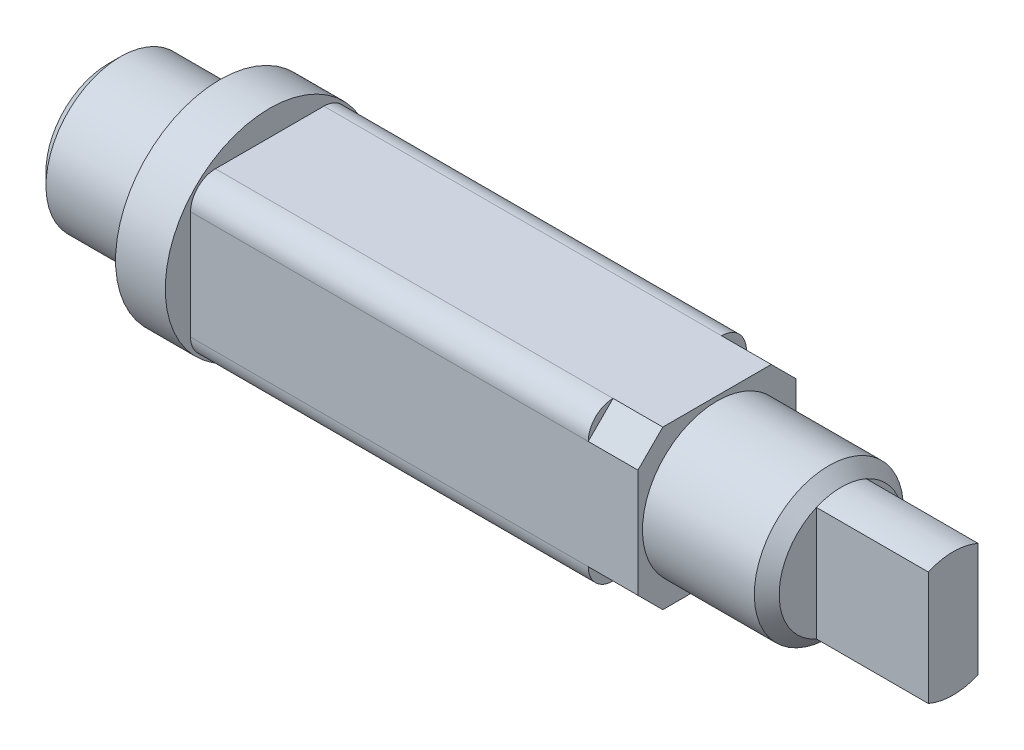
ISO-10303-21;
HEADER;
FILE_DESCRIPTION(('STEP AP214'),'2;1');
FILE_NAME('part.step','',(''),(''),'','','');
FILE_SCHEMA(('AUTOMOTIVE_DESIGN { 1 0 10303 214 1 1 1 1 }'));
ENDSEC;
DATA;
#1=APPLICATION_CONTEXT('core data for automotive mechanical design processes');
#2=APPLICATION_PROTOCOL_DEFINITION('international standard','automotive_design',2000,#1);
#3=PRODUCT_CONTEXT('',#1,'mechanical');
#4=PRODUCT('Part','Part','',(#3));
#5=PRODUCT_RELATED_PRODUCT_CATEGORY('part','',(#4));
#6=PRODUCT_DEFINITION_FORMATION('','',#4);
#7=PRODUCT_DEFINITION_CONTEXT('part definition',#1,'design');
#8=PRODUCT_DEFINITION('design','',#6,#7);
#9=PRODUCT_DEFINITION_SHAPE('','',#8);
#10=(LENGTH_UNIT() NAMED_UNIT(*) SI_UNIT(.MILLI.,.METRE.));
#11=(NAMED_UNIT(*) PLANE_ANGLE_UNIT() SI_UNIT($,.RADIAN.));
#12=(NAMED_UNIT(*) SI_UNIT($,.STERADIAN.) SOLID_ANGLE_UNIT());
#13=UNCERTAINTY_MEASURE_WITH_UNIT(LENGTH_MEASURE(1.E-05),#10,'distance_accuracy_value','');
#14=(GEOMETRIC_REPRESENTATION_CONTEXT(3) GLOBAL_UNCERTAINTY_ASSIGNED_CONTEXT((#13)) GLOBAL_UNIT_ASSIGNED_CONTEXT((#10,
#11,#12)) REPRESENTATION_CONTEXT('',''));
#15=CARTESIAN_POINT('',(0.,0.,0.));
#16=DIRECTION('',(0.,0.,1.));
#17=DIRECTION('',(1.,0.,0.));
#18=AXIS2_PLACEMENT_3D('',#15,#16,#17);
#19=CARTESIAN_POINT('',(29.,2.5,0.));
#20=DIRECTION('',(1.,0.,0.));
#21=DIRECTION('',(0.,1.,0.));
#22=AXIS2_PLACEMENT_3D('',#19,#20,#21);
#23=PLANE('',#22);
#24=CARTESIAN_POINT('',(29.,0.,0.));
#25=DIRECTION('',(1.,0.,0.));
#26=DIRECTION('',(0.,1.,0.));
#27=AXIS2_PLACEMENT_3D('',#24,#25,#26);
#28=CIRCLE('',#27,2.5);
#29=CARTESIAN_POINT('',(29.,-2.29128784747792,-1.));
#30=VERTEX_POINT('',#29);
#31=CARTESIAN_POINT('',(29.,2.29128784747792,-1.));
#32=VERTEX_POINT('',#31);
#33=EDGE_CURVE('E533',#30,#32,#28,.T.);
#34=ORIENTED_EDGE('',*,*,#33,.T.);
#35=DIRECTION('',(0.,-1.,0.));
#36=VECTOR('',#35,1.);
#37=CARTESIAN_POINT('',(29.,2.5,-1.));
#38=LINE('',#37,#36);
#39=EDGE_CURVE('E58',#32,#30,#38,.T.);
#40=ORIENTED_EDGE('',*,*,#39,.T.);
#41=EDGE_LOOP('',(#34,#40));
#42=FACE_BOUND('',#41,.T.);
#43=ADVANCED_FACE('F37',(#42),#23,.T.);
#44=CARTESIAN_POINT('',(29.,2.29128784747792,1.));
#45=VERTEX_POINT('',#44);
#46=CARTESIAN_POINT('',(29.,-2.29128784747792,1.));
#47=VERTEX_POINT('',#46);
#48=EDGE_CURVE('E182',#45,#47,#28,.T.);
#49=ORIENTED_EDGE('',*,*,#48,.T.);
#50=DIRECTION('',(0.,1.,0.));
#51=VECTOR('',#50,1.);
#52=CARTESIAN_POINT('',(29.,2.5,1.));
#53=LINE('',#52,#51);
#54=EDGE_CURVE('E173',#47,#45,#53,.T.);
#55=ORIENTED_EDGE('',*,*,#54,.T.);
#56=EDGE_LOOP('',(#49,#55));
#57=FACE_BOUND('',#56,.T.);
#58=ADVANCED_FACE('F318',(#57),#23,.T.);
#59=CARTESIAN_POINT('',(22.,2.18198051533946,-2.18198051533946));
#60=DIRECTION('',(1.,0.,0.));
#61=DIRECTION('',(0.,0.,-1.));
#62=AXIS2_PLACEMENT_3D('',#59,#60,#61);
#63=PLANE('',#62);
#64=DIRECTION('',(0.,0.707106781186548,0.707106781186547));
#65=VECTOR('',#64,1.);
#66=CARTESIAN_POINT('',(22.,2.18198051533946,-3.18198051533946));
#67=LINE('',#66,#65);
#68=CARTESIAN_POINT('',(22.,2.18198051533946,-3.18198051533946));
#69=VERTEX_POINT('',#68);
#70=CARTESIAN_POINT('',(22.,3.18198051533946,-2.18198051533946));
#71=VERTEX_POINT('',#70);
#72=EDGE_CURVE('E193',#69,#71,#67,.T.);
#73=ORIENTED_EDGE('',*,*,#72,.F.);
#74=CARTESIAN_POINT('',(22.,2.18198051533946,-2.18198051533946));
#75=DIRECTION('',(1.,0.,0.));
#76=DIRECTION('',(0.,0.,-1.));
#77=AXIS2_PLACEMENT_3D('',#74,#75,#76);
#78=CIRCLE('',#77,1.);
#79=EDGE_CURVE('E242',#69,#71,#78,.T.);
#80=ORIENTED_EDGE('',*,*,#79,.T.);
#81=EDGE_LOOP('',(#73,#80));
#82=FACE_BOUND('',#81,.T.);
#83=ADVANCED_FACE('F323',(#82),#63,.T.);
#84=DIRECTION('',(0.,0.707106781186548,-0.707106781186548));
#85=VECTOR('',#84,1.);
#86=CARTESIAN_POINT('',(22.,-2.18198051533946,-3.18198051533946));
#87=LINE('',#86,#85);
#88=CARTESIAN_POINT('',(22.,-3.18198051533946,-2.18198051533946));
#89=VERTEX_POINT('',#88);
#90=CARTESIAN_POINT('',(22.,-2.18198051533946,-3.18198051533946));
#91=VERTEX_POINT('',#90);
#92=EDGE_CURVE('E213',#89,#91,#87,.T.);
#93=ORIENTED_EDGE('',*,*,#92,.F.);
#94=CARTESIAN_POINT('',(22.,-2.18198051533946,-2.18198051533946));
#95=DIRECTION('',(1.,0.,0.));
#96=DIRECTION('',(0.,0.,-1.));
#97=AXIS2_PLACEMENT_3D('',#94,#95,#96);
#98=CIRCLE('',#97,1.);
#99=EDGE_CURVE('E250',#89,#91,#98,.T.);
#100=ORIENTED_EDGE('',*,*,#99,.T.);
#101=EDGE_LOOP('',(#93,#100));
#102=FACE_BOUND('',#101,.T.);
#103=ADVANCED_FACE('F443',(#102),#63,.T.);
#104=DIRECTION('',(0.,-0.707106781186548,-0.707106781186548));
#105=VECTOR('',#104,1.);
#106=CARTESIAN_POINT('',(22.,-3.18198051533946,2.18198051533946));
#107=LINE('',#106,#105);
#108=CARTESIAN_POINT('',(22.,-2.18198051533946,3.18198051533946));
#109=VERTEX_POINT('',#108);
#110=CARTESIAN_POINT('',(22.,-3.18198051533946,2.18198051533946));
#111=VERTEX_POINT('',#110);
#112=EDGE_CURVE('E210',#109,#111,#107,.T.);
#113=ORIENTED_EDGE('',*,*,#112,.F.);
#114=CARTESIAN_POINT('',(22.,-2.18198051533946,2.18198051533946));
#115=DIRECTION('',(1.,0.,0.));
#116=DIRECTION('',(0.,0.,-1.));
#117=AXIS2_PLACEMENT_3D('',#114,#115,#116);
#118=CIRCLE('',#117,1.);
#119=EDGE_CURVE('E248',#109,#111,#118,.T.);
#120=ORIENTED_EDGE('',*,*,#119,.T.);
#121=EDGE_LOOP('',(#113,#120));
#122=FACE_BOUND('',#121,.T.);
#123=ADVANCED_FACE('F314',(#122),#63,.T.);
#124=CARTESIAN_POINT('',(6.,4.2,0.));
#125=DIRECTION('',(1.,0.,0.));
#126=DIRECTION('',(0.,1.,0.));
#127=AXIS2_PLACEMENT_3D('',#124,#125,#126);
#128=PLANE('',#127);
#129=CARTESIAN_POINT('',(6.,0.,0.));
#130=DIRECTION('',(1.,0.,0.));
#131=DIRECTION('',(0.,1.,0.));
#132=AXIS2_PLACEMENT_3D('',#129,#130,#131);
#133=CIRCLE('',#132,4.2);
#134=CARTESIAN_POINT('',(6.,4.2,0.));
#135=VERTEX_POINT('',#134);
#136=EDGE_CURVE('E290',#135,#135,#133,.T.);
#137=ORIENTED_EDGE('',*,*,#136,.T.);
#138=EDGE_LOOP('',(#137));
#139=FACE_BOUND('',#138,.T.);
#140=DIRECTION('',(0.,0.,1.));
#141=VECTOR('',#140,1.);
#142=CARTESIAN_POINT('',(6.,3.18198051533946,2.18198051533946));
#143=LINE('',#142,#141);
#144=CARTESIAN_POINT('',(6.,3.18198051533946,-2.18198051533946));
#145=VERTEX_POINT('',#144);
#146=CARTESIAN_POINT('',(6.,3.18198051533946,2.18198051533946));
#147=VERTEX_POINT('',#146);
#148=EDGE_CURVE('E255',#145,#147,#143,.T.);
#149=ORIENTED_EDGE('',*,*,#148,.F.);
#150=CARTESIAN_POINT('',(6.,2.18198051533946,-2.18198051533946));
#151=DIRECTION('',(1.,0.,0.));
#152=DIRECTION('',(0.,0.,-1.));
#153=AXIS2_PLACEMENT_3D('',#150,#151,#152);
#154=CIRCLE('',#153,1.);
#155=CARTESIAN_POINT('',(6.,2.18198051533946,-3.18198051533946));
#156=VERTEX_POINT('',#155);
#157=EDGE_CURVE('E241',#156,#145,#154,.T.);
#158=ORIENTED_EDGE('',*,*,#157,.F.);
#159=DIRECTION('',(0.,1.,0.));
#160=VECTOR('',#159,1.);
#161=CARTESIAN_POINT('',(6.,2.18198051533946,-3.18198051533946));
#162=LINE('',#161,#160);
#163=CARTESIAN_POINT('',(6.,-2.18198051533946,-3.18198051533946));
#164=VERTEX_POINT('',#163);
#165=EDGE_CURVE('E245',#164,#156,#162,.T.);
#166=ORIENTED_EDGE('',*,*,#165,.F.);
#167=CARTESIAN_POINT('',(6.,-2.18198051533946,-2.18198051533946));
#168=DIRECTION('',(1.,0.,0.));
#169=DIRECTION('',(0.,0.,-1.));
#170=AXIS2_PLACEMENT_3D('',#167,#168,#169);
#171=CIRCLE('',#170,1.);
#172=CARTESIAN_POINT('',(6.,-3.18198051533946,-2.18198051533946));
#173=VERTEX_POINT('',#172);
#174=EDGE_CURVE('E265',#173,#164,#171,.T.);
#175=ORIENTED_EDGE('',*,*,#174,.F.);
#176=DIRECTION('',(0.,0.,-1.));
#177=VECTOR('',#176,1.);
#178=CARTESIAN_POINT('',(6.,-3.18198051533946,2.18198051533946));
#179=LINE('',#178,#177);
#180=CARTESIAN_POINT('',(6.,-3.18198051533946,2.18198051533946));
#181=VERTEX_POINT('',#180);
#182=EDGE_CURVE('E263',#181,#173,#179,.T.);
#183=ORIENTED_EDGE('',*,*,#182,.F.);
#184=CARTESIAN_POINT('',(6.,-2.18198051533946,2.18198051533946));
#185=DIRECTION('',(1.,0.,0.));
#186=DIRECTION('',(0.,0.,-1.));
#187=AXIS2_PLACEMENT_3D('',#184,#185,#186);
#188=CIRCLE('',#187,1.);
#189=CARTESIAN_POINT('',(6.,-2.18198051533946,3.18198051533946));
#190=VERTEX_POINT('',#189);
#191=EDGE_CURVE('E261',#190,#181,#188,.T.);
#192=ORIENTED_EDGE('',*,*,#191,.F.);
#193=DIRECTION('',(0.,-1.,0.));
#194=VECTOR('',#193,1.);
#195=CARTESIAN_POINT('',(6.,2.18198051533946,3.18198051533946));
#196=LINE('',#195,#194);
#197=CARTESIAN_POINT('',(6.,2.18198051533946,3.18198051533946));
#198=VERTEX_POINT('',#197);
#199=EDGE_CURVE('E259',#198,#190,#196,.T.);
#200=ORIENTED_EDGE('',*,*,#199,.F.);
#201=CARTESIAN_POINT('',(6.,2.18198051533946,2.18198051533946));
#202=DIRECTION('',(1.,0.,0.));
#203=DIRECTION('',(0.,0.,1.));
#204=AXIS2_PLACEMENT_3D('',#201,#202,#203);
#205=CIRCLE('',#204,1.);
#206=EDGE_CURVE('E257',#147,#198,#205,.T.);
#207=ORIENTED_EDGE('',*,*,#206,.F.);
#208=EDGE_LOOP('',(#149,#158,#166,#175,#183,#192,#200,#207));
#209=FACE_BOUND('',#208,.T.);
#210=ADVANCED_FACE('F308',(#139,#209),#128,.T.);
#211=CARTESIAN_POINT('',(-0.5,2.5,0.));
#212=DIRECTION('',(-1.,0.,0.));
#213=DIRECTION('',(0.,-1.,0.));
#214=AXIS2_PLACEMENT_3D('',#211,#212,#213);
#215=PLANE('',#214);
#216=CARTESIAN_POINT('',(-0.5,0.,0.));
#217=DIRECTION('',(1.,0.,0.));
#218=DIRECTION('',(0.,1.,0.));
#219=AXIS2_PLACEMENT_3D('',#216,#217,#218);
#220=CIRCLE('',#219,2.5);
#221=CARTESIAN_POINT('',(-0.5,2.5,0.));
#222=VERTEX_POINT('',#221);
#223=EDGE_CURVE('E45',#222,#222,#220,.T.);
#224=ORIENTED_EDGE('',*,*,#223,.F.);
#225=EDGE_LOOP('',(#224));
#226=FACE_BOUND('',#225,.T.);
#227=ADVANCED_FACE('F39',(#226),#215,.T.);
#228=CARTESIAN_POINT('',(0.,0.,0.));
#229=DIRECTION('',(1.,0.,0.));
#230=DIRECTION('',(0.,1.,0.));
#231=AXIS2_PLACEMENT_3D('',#228,#229,#230);
#232=CONICAL_SURFACE('',#231,3.,0.785398163397448);
#233=ORIENTED_EDGE('',*,*,#223,.T.);
#234=EDGE_LOOP('',(#233));
#235=FACE_BOUND('',#234,.T.);
#236=CARTESIAN_POINT('',(0.,0.,0.));
#237=DIRECTION('',(1.,0.,0.));
#238=DIRECTION('',(0.,1.,0.));
#239=AXIS2_PLACEMENT_3D('',#236,#237,#238);
#240=CIRCLE('',#239,3.);
#241=CARTESIAN_POINT('',(0.,3.,0.));
#242=VERTEX_POINT('',#241);
#243=EDGE_CURVE('E299',#242,#242,#240,.T.);
#244=ORIENTED_EDGE('',*,*,#243,.F.);
#245=EDGE_LOOP('',(#244));
#246=FACE_BOUND('',#245,.T.);
#247=ADVANCED_FACE('F304',(#235,#246),#232,.T.);
#248=CARTESIAN_POINT('',(6.,0.,0.));
#249=DIRECTION('',(1.,0.,0.));
#250=DIRECTION('',(0.,1.,0.));
#251=AXIS2_PLACEMENT_3D('',#248,#249,#250);
#252=CYLINDRICAL_SURFACE('',#251,3.);
#253=ORIENTED_EDGE('',*,*,#243,.T.);
#254=EDGE_LOOP('',(#253));
#255=FACE_BOUND('',#254,.T.);
#256=CARTESIAN_POINT('',(4.,0.,0.));
#257=DIRECTION('',(1.,0.,0.));
#258=DIRECTION('',(0.,1.,0.));
#259=AXIS2_PLACEMENT_3D('',#256,#257,#258);
#260=CIRCLE('',#259,3.);
#261=CARTESIAN_POINT('',(4.,3.,0.));
#262=VERTEX_POINT('',#261);
#263=EDGE_CURVE('E296',#262,#262,#260,.T.);
#264=ORIENTED_EDGE('',*,*,#263,.F.);
#265=EDGE_LOOP('',(#264));
#266=FACE_BOUND('',#265,.T.);
#267=ADVANCED_FACE('F313',(#255,#266),#252,.T.);
#268=CARTESIAN_POINT('',(4.,3.,0.));
#269=DIRECTION('',(-1.,0.,0.));
#270=DIRECTION('',(0.,-1.,0.));
#271=AXIS2_PLACEMENT_3D('',#268,#269,#270);
#272=PLANE('',#271);
#273=ORIENTED_EDGE('',*,*,#263,.T.);
#274=EDGE_LOOP('',(#273));
#275=FACE_BOUND('',#274,.T.);
#276=CARTESIAN_POINT('',(4.,0.,0.));
#277=DIRECTION('',(1.,0.,0.));
#278=DIRECTION('',(0.,1.,0.));
#279=AXIS2_PLACEMENT_3D('',#276,#277,#278);
#280=CIRCLE('',#279,4.2);
#281=CARTESIAN_POINT('',(4.,4.2,0.));
#282=VERTEX_POINT('',#281);
#283=EDGE_CURVE('E293',#282,#282,#280,.T.);
#284=ORIENTED_EDGE('',*,*,#283,.F.);
#285=EDGE_LOOP('',(#284));
#286=FACE_BOUND('',#285,.T.);
#287=ADVANCED_FACE('F388',(#275,#286),#272,.T.);
#288=CARTESIAN_POINT('',(6.,0.,0.));
#289=DIRECTION('',(1.,0.,0.));
#290=DIRECTION('',(0.,1.,0.));
#291=AXIS2_PLACEMENT_3D('',#288,#289,#290);
#292=CYLINDRICAL_SURFACE('',#291,4.2);
#293=ORIENTED_EDGE('',*,*,#283,.T.);
#294=EDGE_LOOP('',(#293));
#295=FACE_BOUND('',#294,.T.);
#296=ORIENTED_EDGE('',*,*,#136,.F.);
#297=EDGE_LOOP('',(#296));
#298=FACE_BOUND('',#297,.T.);
#299=ADVANCED_FACE('F383',(#295,#298),#292,.T.);
#300=CARTESIAN_POINT('',(22.,2.18198051533946,-2.18198051533946));
#301=DIRECTION('',(-1.,0.,0.));
#302=DIRECTION('',(0.,0.,1.));
#303=AXIS2_PLACEMENT_3D('',#300,#301,#302);
#304=CYLINDRICAL_SURFACE('',#303,1.);
#305=ORIENTED_EDGE('',*,*,#157,.T.);
#306=DIRECTION('',(-1.,0.,0.));
#307=VECTOR('',#306,1.);
#308=CARTESIAN_POINT('',(22.,3.18198051533946,-2.18198051533946));
#309=LINE('',#308,#307);
#310=EDGE_CURVE('E288',#71,#145,#309,.T.);
#311=ORIENTED_EDGE('',*,*,#310,.F.);
#312=ORIENTED_EDGE('',*,*,#79,.F.);
#313=DIRECTION('',(-1.,0.,0.));
#314=VECTOR('',#313,1.);
#315=CARTESIAN_POINT('',(22.,2.18198051533946,-3.18198051533946));
#316=LINE('',#315,#314);
#317=EDGE_CURVE('E252',#69,#156,#316,.T.);
#318=ORIENTED_EDGE('',*,*,#317,.T.);
#319=EDGE_LOOP('',(#305,#311,#312,#318));
#320=FACE_BOUND('',#319,.T.);
#321=ADVANCED_FACE('F380',(#320),#304,.T.);
#322=CARTESIAN_POINT('',(22.,3.18198051533946,2.18198051533946));
#323=DIRECTION('',(0.,-1.,0.));
#324=DIRECTION('',(0.,0.,-1.));
#325=AXIS2_PLACEMENT_3D('',#322,#323,#324);
#326=PLANE('',#325);
#327=ORIENTED_EDGE('',*,*,#148,.T.);
#328=DIRECTION('',(-1.,0.,0.));
#329=VECTOR('',#328,1.);
#330=CARTESIAN_POINT('',(22.,3.18198051533946,2.18198051533946));
#331=LINE('',#330,#329);
#332=CARTESIAN_POINT('',(22.,3.18198051533946,2.18198051533946));
#333=VERTEX_POINT('',#332);
#334=EDGE_CURVE('E285',#333,#147,#331,.T.);
#335=ORIENTED_EDGE('',*,*,#334,.F.);
#336=DIRECTION('',(-1.,0.,0.));
#337=VECTOR('',#336,1.);
#338=CARTESIAN_POINT('',(24.,3.18198051533946,2.18198051533946));
#339=LINE('',#338,#337);
#340=CARTESIAN_POINT('',(24.,3.18198051533946,2.18198051533946));
#341=VERTEX_POINT('',#340);
#342=EDGE_CURVE('E238',#341,#333,#339,.T.);
#343=ORIENTED_EDGE('',*,*,#342,.F.);
#344=DIRECTION('',(0.,0.,1.));
#345=VECTOR('',#344,1.);
#346=CARTESIAN_POINT('',(24.,3.18198051533946,-2.18198051533946));
#347=LINE('',#346,#345);
#348=CARTESIAN_POINT('',(24.,3.18198051533946,-2.18198051533946));
#349=VERTEX_POINT('',#348);
#350=EDGE_CURVE('E189',#349,#341,#347,.T.);
#351=ORIENTED_EDGE('',*,*,#350,.F.);
#352=DIRECTION('',(-1.,0.,0.));
#353=VECTOR('',#352,1.);
#354=CARTESIAN_POINT('',(24.,3.18198051533946,-2.18198051533946));
#355=LINE('',#354,#353);
#356=EDGE_CURVE('E207',#349,#71,#355,.T.);
#357=ORIENTED_EDGE('',*,*,#356,.T.);
#358=ORIENTED_EDGE('',*,*,#310,.T.);
#359=EDGE_LOOP('',(#327,#335,#343,#351,#357,#358));
#360=FACE_BOUND('',#359,.T.);
#361=ADVANCED_FACE('F376',(#360),#326,.F.);
#362=CARTESIAN_POINT('',(22.,2.18198051533946,2.18198051533946));
#363=DIRECTION('',(-1.,0.,0.));
#364=DIRECTION('',(0.,0.,1.));
#365=AXIS2_PLACEMENT_3D('',#362,#363,#364);
#366=CYLINDRICAL_SURFACE('',#365,1.);
#367=ORIENTED_EDGE('',*,*,#206,.T.);
#368=DIRECTION('',(-1.,0.,0.));
#369=VECTOR('',#368,1.);
#370=CARTESIAN_POINT('',(22.,2.18198051533946,3.18198051533946));
#371=LINE('',#370,#369);
#372=CARTESIAN_POINT('',(22.,2.18198051533946,3.18198051533946));
#373=VERTEX_POINT('',#372);
#374=EDGE_CURVE('E282',#373,#198,#371,.T.);
#375=ORIENTED_EDGE('',*,*,#374,.F.);
#376=CARTESIAN_POINT('',(22.,2.18198051533946,2.18198051533946));
#377=DIRECTION('',(1.,0.,0.));
#378=DIRECTION('',(0.,0.,1.));
#379=AXIS2_PLACEMENT_3D('',#376,#377,#378);
#380=CIRCLE('',#379,1.);
#381=EDGE_CURVE('E244',#333,#373,#380,.T.);
#382=ORIENTED_EDGE('',*,*,#381,.F.);
#383=ORIENTED_EDGE('',*,*,#334,.T.);
#384=EDGE_LOOP('',(#367,#375,#382,#383));
#385=FACE_BOUND('',#384,.T.);
#386=ADVANCED_FACE('F372',(#385),#366,.T.);
#387=CARTESIAN_POINT('',(22.,2.18198051533946,3.18198051533946));
#388=DIRECTION('',(0.,0.,-1.));
#389=DIRECTION('',(0.,1.,0.));
#390=AXIS2_PLACEMENT_3D('',#387,#388,#389);
#391=PLANE('',#390);
#392=ORIENTED_EDGE('',*,*,#199,.T.);
#393=DIRECTION('',(-1.,0.,0.));
#394=VECTOR('',#393,1.);
#395=CARTESIAN_POINT('',(22.,-2.18198051533946,3.18198051533946));
#396=LINE('',#395,#394);
#397=EDGE_CURVE('E279',#109,#190,#396,.T.);
#398=ORIENTED_EDGE('',*,*,#397,.F.);
#399=DIRECTION('',(-1.,0.,0.));
#400=VECTOR('',#399,1.);
#401=CARTESIAN_POINT('',(24.,-2.18198051533946,3.18198051533946));
#402=LINE('',#401,#400);
#403=CARTESIAN_POINT('',(24.,-2.18198051533946,3.18198051533946));
#404=VERTEX_POINT('',#403);
#405=EDGE_CURVE('E232',#404,#109,#402,.T.);
#406=ORIENTED_EDGE('',*,*,#405,.F.);
#407=DIRECTION('',(0.,-1.,0.));
#408=VECTOR('',#407,1.);
#409=CARTESIAN_POINT('',(24.,2.18198051533946,3.18198051533946));
#410=LINE('',#409,#408);
#411=CARTESIAN_POINT('',(24.,2.18198051533946,3.18198051533946));
#412=VERTEX_POINT('',#411);
#413=EDGE_CURVE('E195',#412,#404,#410,.T.);
#414=ORIENTED_EDGE('',*,*,#413,.F.);
#415=DIRECTION('',(-1.,0.,0.));
#416=VECTOR('',#415,1.);
#417=CARTESIAN_POINT('',(24.,2.18198051533946,3.18198051533946));
#418=LINE('',#417,#416);
#419=EDGE_CURVE('E235',#412,#373,#418,.T.);
#420=ORIENTED_EDGE('',*,*,#419,.T.);
#421=ORIENTED_EDGE('',*,*,#374,.T.);
#422=EDGE_LOOP('',(#392,#398,#406,#414,#420,#421));
#423=FACE_BOUND('',#422,.T.);
#424=ADVANCED_FACE('F368',(#423),#391,.F.);
#425=CARTESIAN_POINT('',(22.,-2.18198051533946,2.18198051533946));
#426=DIRECTION('',(-1.,0.,0.));
#427=DIRECTION('',(0.,0.,1.));
#428=AXIS2_PLACEMENT_3D('',#425,#426,#427);
#429=CYLINDRICAL_SURFACE('',#428,1.);
#430=ORIENTED_EDGE('',*,*,#191,.T.);
#431=DIRECTION('',(-1.,0.,0.));
#432=VECTOR('',#431,1.);
#433=CARTESIAN_POINT('',(22.,-3.18198051533946,2.18198051533946));
#434=LINE('',#433,#432);
#435=EDGE_CURVE('E276',#111,#181,#434,.T.);
#436=ORIENTED_EDGE('',*,*,#435,.F.);
#437=ORIENTED_EDGE('',*,*,#119,.F.);
#438=ORIENTED_EDGE('',*,*,#397,.T.);
#439=EDGE_LOOP('',(#430,#436,#437,#438));
#440=FACE_BOUND('',#439,.T.);
#441=ADVANCED_FACE('F364',(#440),#429,.T.);
#442=CARTESIAN_POINT('',(22.,-3.18198051533946,2.18198051533946));
#443=DIRECTION('',(0.,1.,0.));
#444=DIRECTION('',(0.,0.,1.));
#445=AXIS2_PLACEMENT_3D('',#442,#443,#444);
#446=PLANE('',#445);
#447=ORIENTED_EDGE('',*,*,#182,.T.);
#448=DIRECTION('',(-1.,0.,0.));
#449=VECTOR('',#448,1.);
#450=CARTESIAN_POINT('',(22.,-3.18198051533946,-2.18198051533946));
#451=LINE('',#450,#449);
#452=EDGE_CURVE('E273',#89,#173,#451,.T.);
#453=ORIENTED_EDGE('',*,*,#452,.F.);
#454=DIRECTION('',(-1.,0.,0.));
#455=VECTOR('',#454,1.);
#456=CARTESIAN_POINT('',(24.,-3.18198051533946,-2.18198051533946));
#457=LINE('',#456,#455);
#458=CARTESIAN_POINT('',(24.,-3.18198051533946,-2.18198051533946));
#459=VERTEX_POINT('',#458);
#460=EDGE_CURVE('E226',#459,#89,#457,.T.);
#461=ORIENTED_EDGE('',*,*,#460,.F.);
#462=DIRECTION('',(0.,0.,-1.));
#463=VECTOR('',#462,1.);
#464=CARTESIAN_POINT('',(24.,-3.18198051533946,-2.18198051533946));
#465=LINE('',#464,#463);
#466=CARTESIAN_POINT('',(24.,-3.18198051533946,2.18198051533946));
#467=VERTEX_POINT('',#466);
#468=EDGE_CURVE('E199',#467,#459,#465,.T.);
#469=ORIENTED_EDGE('',*,*,#468,.F.);
#470=DIRECTION('',(-1.,0.,0.));
#471=VECTOR('',#470,1.);
#472=CARTESIAN_POINT('',(24.,-3.18198051533946,2.18198051533946));
#473=LINE('',#472,#471);
#474=EDGE_CURVE('E229',#467,#111,#473,.T.);
#475=ORIENTED_EDGE('',*,*,#474,.T.);
#476=ORIENTED_EDGE('',*,*,#435,.T.);
#477=EDGE_LOOP('',(#447,#453,#461,#469,#475,#476));
#478=FACE_BOUND('',#477,.T.);
#479=ADVANCED_FACE('F360',(#478),#446,.F.);
#480=CARTESIAN_POINT('',(22.,-2.18198051533946,-2.18198051533946));
#481=DIRECTION('',(-1.,0.,0.));
#482=DIRECTION('',(0.,0.,1.));
#483=AXIS2_PLACEMENT_3D('',#480,#481,#482);
#484=CYLINDRICAL_SURFACE('',#483,1.);
#485=ORIENTED_EDGE('',*,*,#174,.T.);
#486=DIRECTION('',(-1.,0.,0.));
#487=VECTOR('',#486,1.);
#488=CARTESIAN_POINT('',(22.,-2.18198051533946,-3.18198051533946));
#489=LINE('',#488,#487);
#490=EDGE_CURVE('E271',#91,#164,#489,.T.);
#491=ORIENTED_EDGE('',*,*,#490,.F.);
#492=ORIENTED_EDGE('',*,*,#99,.F.);
#493=ORIENTED_EDGE('',*,*,#452,.T.);
#494=EDGE_LOOP('',(#485,#491,#492,#493));
#495=FACE_BOUND('',#494,.T.);
#496=ADVANCED_FACE('F356',(#495),#484,.T.);
#497=CARTESIAN_POINT('',(22.,2.18198051533946,-3.18198051533946));
#498=DIRECTION('',(0.,0.,1.));
#499=DIRECTION('',(0.,-1.,0.));
#500=AXIS2_PLACEMENT_3D('',#497,#498,#499);
#501=PLANE('',#500);
#502=ORIENTED_EDGE('',*,*,#165,.T.);
#503=ORIENTED_EDGE('',*,*,#317,.F.);
#504=DIRECTION('',(-1.,0.,0.));
#505=VECTOR('',#504,1.);
#506=CARTESIAN_POINT('',(24.,2.18198051533946,-3.18198051533946));
#507=LINE('',#506,#505);
#508=CARTESIAN_POINT('',(24.,2.18198051533946,-3.18198051533946));
#509=VERTEX_POINT('',#508);
#510=EDGE_CURVE('E220',#509,#69,#507,.T.);
#511=ORIENTED_EDGE('',*,*,#510,.F.);
#512=DIRECTION('',(0.,1.,0.));
#513=VECTOR('',#512,1.);
#514=CARTESIAN_POINT('',(24.,2.18198051533946,-3.18198051533946));
#515=LINE('',#514,#513);
#516=CARTESIAN_POINT('',(24.,-2.18198051533946,-3.18198051533946));
#517=VERTEX_POINT('',#516);
#518=EDGE_CURVE('E203',#517,#509,#515,.T.);
#519=ORIENTED_EDGE('',*,*,#518,.F.);
#520=DIRECTION('',(-1.,0.,0.));
#521=VECTOR('',#520,1.);
#522=CARTESIAN_POINT('',(24.,-2.18198051533946,-3.18198051533946));
#523=LINE('',#522,#521);
#524=EDGE_CURVE('E223',#517,#91,#523,.T.);
#525=ORIENTED_EDGE('',*,*,#524,.T.);
#526=ORIENTED_EDGE('',*,*,#490,.T.);
#527=EDGE_LOOP('',(#502,#503,#511,#519,#525,#526));
#528=FACE_BOUND('',#527,.T.);
#529=ADVANCED_FACE('F352',(#528),#501,.F.);
#530=DIRECTION('',(0.,-0.707106781186548,0.707106781186548));
#531=VECTOR('',#530,1.);
#532=CARTESIAN_POINT('',(22.,3.18198051533946,2.18198051533946));
#533=LINE('',#532,#531);
#534=EDGE_CURVE('E188',#333,#373,#533,.T.);
#535=ORIENTED_EDGE('',*,*,#534,.F.);
#536=ORIENTED_EDGE('',*,*,#381,.T.);
#537=EDGE_LOOP('',(#535,#536));
#538=FACE_BOUND('',#537,.T.);
#539=ADVANCED_FACE('F348',(#538),#63,.T.);
#540=CARTESIAN_POINT('',(24.,3.18198051533946,2.18198051533946));
#541=DIRECTION('',(0.,-0.707106781186547,-0.707106781186547));
#542=DIRECTION('',(0.,0.707106781186548,-0.707106781186548));
#543=AXIS2_PLACEMENT_3D('',#540,#541,#542);
#544=PLANE('',#543);
#545=ORIENTED_EDGE('',*,*,#534,.T.);
#546=ORIENTED_EDGE('',*,*,#419,.F.);
#547=DIRECTION('',(0.,-0.707106781186548,0.707106781186548));
#548=VECTOR('',#547,1.);
#549=CARTESIAN_POINT('',(24.,3.18198051533946,2.18198051533946));
#550=LINE('',#549,#548);
#551=EDGE_CURVE('E192',#341,#412,#550,.T.);
#552=ORIENTED_EDGE('',*,*,#551,.F.);
#553=ORIENTED_EDGE('',*,*,#342,.T.);
#554=EDGE_LOOP('',(#545,#546,#552,#553));
#555=FACE_BOUND('',#554,.T.);
#556=ADVANCED_FACE('F344',(#555),#544,.F.);
#557=CARTESIAN_POINT('',(24.,-3.18198051533946,2.18198051533946));
#558=DIRECTION('',(0.,0.707106781186547,-0.707106781186547));
#559=DIRECTION('',(0.,0.707106781186548,0.707106781186548));
#560=AXIS2_PLACEMENT_3D('',#557,#558,#559);
#561=PLANE('',#560);
#562=ORIENTED_EDGE('',*,*,#112,.T.);
#563=ORIENTED_EDGE('',*,*,#474,.F.);
#564=DIRECTION('',(0.,-0.707106781186548,-0.707106781186548));
#565=VECTOR('',#564,1.);
#566=CARTESIAN_POINT('',(24.,-3.18198051533946,2.18198051533946));
#567=LINE('',#566,#565);
#568=EDGE_CURVE('E197',#404,#467,#567,.T.);
#569=ORIENTED_EDGE('',*,*,#568,.F.);
#570=ORIENTED_EDGE('',*,*,#405,.T.);
#571=EDGE_LOOP('',(#562,#563,#569,#570));
#572=FACE_BOUND('',#571,.T.);
#573=ADVANCED_FACE('F340',(#572),#561,.F.);
#574=CARTESIAN_POINT('',(24.,-2.18198051533946,-3.18198051533946));
#575=DIRECTION('',(0.,0.707106781186547,0.707106781186547));
#576=DIRECTION('',(0.,-0.707106781186548,0.707106781186548));
#577=AXIS2_PLACEMENT_3D('',#574,#575,#576);
#578=PLANE('',#577);
#579=ORIENTED_EDGE('',*,*,#92,.T.);
#580=ORIENTED_EDGE('',*,*,#524,.F.);
#581=DIRECTION('',(0.,0.707106781186548,-0.707106781186548));
#582=VECTOR('',#581,1.);
#583=CARTESIAN_POINT('',(24.,-2.18198051533946,-3.18198051533946));
#584=LINE('',#583,#582);
#585=EDGE_CURVE('E201',#459,#517,#584,.T.);
#586=ORIENTED_EDGE('',*,*,#585,.F.);
#587=ORIENTED_EDGE('',*,*,#460,.T.);
#588=EDGE_LOOP('',(#579,#580,#586,#587));
#589=FACE_BOUND('',#588,.T.);
#590=ADVANCED_FACE('F336',(#589),#578,.F.);
#591=CARTESIAN_POINT('',(24.,2.18198051533946,-3.18198051533946));
#592=DIRECTION('',(0.,-0.707106781186547,0.707106781186548));
#593=DIRECTION('',(0.,-0.707106781186548,-0.707106781186547));
#594=AXIS2_PLACEMENT_3D('',#591,#592,#593);
#595=PLANE('',#594);
#596=ORIENTED_EDGE('',*,*,#72,.T.);
#597=ORIENTED_EDGE('',*,*,#356,.F.);
#598=DIRECTION('',(0.,0.707106781186548,0.707106781186547));
#599=VECTOR('',#598,1.);
#600=CARTESIAN_POINT('',(24.,2.18198051533946,-3.18198051533946));
#601=LINE('',#600,#599);
#602=EDGE_CURVE('E205',#509,#349,#601,.T.);
#603=ORIENTED_EDGE('',*,*,#602,.F.);
#604=ORIENTED_EDGE('',*,*,#510,.T.);
#605=EDGE_LOOP('',(#596,#597,#603,#604));
#606=FACE_BOUND('',#605,.T.);
#607=ADVANCED_FACE('F332',(#606),#595,.F.);
#608=CARTESIAN_POINT('',(24.,0.,0.));
#609=DIRECTION('',(1.,0.,0.));
#610=DIRECTION('',(0.,0.,-1.));
#611=AXIS2_PLACEMENT_3D('',#608,#609,#610);
#612=PLANE('',#611);
#613=CARTESIAN_POINT('',(24.,0.,0.));
#614=DIRECTION('',(1.,0.,0.));
#615=DIRECTION('',(0.,0.,-1.));
#616=AXIS2_PLACEMENT_3D('',#613,#614,#615);
#617=CIRCLE('',#616,3.);
#618=CARTESIAN_POINT('',(24.,0.,-3.));
#619=VERTEX_POINT('',#618);
#620=EDGE_CURVE('E11',#619,#619,#617,.T.);
#621=ORIENTED_EDGE('',*,*,#620,.F.);
#622=EDGE_LOOP('',(#621));
#623=FACE_BOUND('',#622,.T.);
#624=ORIENTED_EDGE('',*,*,#350,.T.);
#625=ORIENTED_EDGE('',*,*,#551,.T.);
#626=ORIENTED_EDGE('',*,*,#413,.T.);
#627=ORIENTED_EDGE('',*,*,#568,.T.);
#628=ORIENTED_EDGE('',*,*,#468,.T.);
#629=ORIENTED_EDGE('',*,*,#585,.T.);
#630=ORIENTED_EDGE('',*,*,#518,.T.);
#631=ORIENTED_EDGE('',*,*,#602,.T.);
#632=EDGE_LOOP('',(#624,#625,#626,#627,#628,#629,#630,#631));
#633=FACE_BOUND('',#632,.T.);
#634=ADVANCED_FACE('F329',(#623,#633),#612,.T.);
#635=CARTESIAN_POINT('',(29.,0.,0.));
#636=DIRECTION('',(1.,0.,0.));
#637=DIRECTION('',(0.,1.,0.));
#638=AXIS2_PLACEMENT_3D('',#635,#636,#637);
#639=CYLINDRICAL_SURFACE('',#638,3.);
#640=ORIENTED_EDGE('',*,*,#620,.T.);
#641=EDGE_LOOP('',(#640));
#642=FACE_BOUND('',#641,.T.);
#643=CARTESIAN_POINT('',(28.5,0.,0.));
#644=DIRECTION('',(1.,0.,0.));
#645=DIRECTION('',(0.,1.,0.));
#646=AXIS2_PLACEMENT_3D('',#643,#644,#645);
#647=CIRCLE('',#646,3.);
#648=CARTESIAN_POINT('',(28.5,3.,0.));
#649=VERTEX_POINT('',#648);
#650=EDGE_CURVE('E185',#649,#649,#647,.T.);
#651=ORIENTED_EDGE('',*,*,#650,.F.);
#652=EDGE_LOOP('',(#651));
#653=FACE_BOUND('',#652,.T.);
#654=ADVANCED_FACE('F327',(#642,#653),#639,.T.);
#655=CARTESIAN_POINT('',(29.,0.,0.));
#656=DIRECTION('',(-1.,0.,0.));
#657=DIRECTION('',(0.,-1.,0.));
#658=AXIS2_PLACEMENT_3D('',#655,#656,#657);
#659=CONICAL_SURFACE('',#658,2.5,0.785398163397448);
#660=ORIENTED_EDGE('',*,*,#650,.T.);
#661=EDGE_LOOP('',(#660));
#662=FACE_BOUND('',#661,.T.);
#663=ORIENTED_EDGE('',*,*,#48,.F.);
#664=EDGE_CURVE('E52',#32,#45,#28,.T.);
#665=ORIENTED_EDGE('',*,*,#664,.F.);
#666=ORIENTED_EDGE('',*,*,#33,.F.);
#667=EDGE_CURVE('E172',#47,#30,#28,.T.);
#668=ORIENTED_EDGE('',*,*,#667,.F.);
#669=EDGE_LOOP('',(#663,#665,#666,#668));
#670=FACE_BOUND('',#669,.T.);
#671=ADVANCED_FACE('F465',(#662,#670),#659,.T.);
#672=CARTESIAN_POINT('',(33.5,0.,0.));
#673=DIRECTION('',(-1.,0.,0.));
#674=DIRECTION('',(0.,0.,1.));
#675=AXIS2_PLACEMENT_3D('',#672,#673,#674);
#676=CYLINDRICAL_SURFACE('',#675,2.5);
#677=ORIENTED_EDGE('',*,*,#667,.T.);
#678=DIRECTION('',(-1.,0.,0.));
#679=VECTOR('',#678,1.);
#680=CARTESIAN_POINT('',(33.5,-2.29128784747792,-1.));
#681=LINE('',#680,#679);
#682=CARTESIAN_POINT('',(33.5,-2.29128784747792,-1.));
#683=VERTEX_POINT('',#682);
#684=EDGE_CURVE('E154',#683,#30,#681,.T.);
#685=ORIENTED_EDGE('',*,*,#684,.F.);
#686=CARTESIAN_POINT('',(33.5,0.,0.));
#687=DIRECTION('',(1.,0.,0.));
#688=DIRECTION('',(0.,0.,-1.));
#689=AXIS2_PLACEMENT_3D('',#686,#687,#688);
#690=CIRCLE('',#689,2.5);
#691=CARTESIAN_POINT('',(33.5,-2.29128784747792,1.));
#692=VERTEX_POINT('',#691);
#693=EDGE_CURVE('E160',#692,#683,#690,.T.);
#694=ORIENTED_EDGE('',*,*,#693,.F.);
#695=DIRECTION('',(-1.,0.,0.));
#696=VECTOR('',#695,1.);
#697=CARTESIAN_POINT('',(33.5,-2.29128784747792,1.));
#698=LINE('',#697,#696);
#699=EDGE_CURVE('E528',#692,#47,#698,.T.);
#700=ORIENTED_EDGE('',*,*,#699,.T.);
#701=EDGE_LOOP('',(#677,#685,#694,#700));
#702=FACE_BOUND('',#701,.T.);
#703=ADVANCED_FACE('F171',(#702),#676,.T.);
#704=CARTESIAN_POINT('',(33.5,1.79128784747792,-1.));
#705=DIRECTION('',(0.,0.,1.));
#706=DIRECTION('',(1.,0.,0.));
#707=AXIS2_PLACEMENT_3D('',#704,#705,#706);
#708=PLANE('',#707);
#709=ORIENTED_EDGE('',*,*,#39,.F.);
#710=DIRECTION('',(-1.,0.,0.));
#711=VECTOR('',#710,1.);
#712=CARTESIAN_POINT('',(33.5,2.29128784747792,-1.));
#713=LINE('',#712,#711);
#714=CARTESIAN_POINT('',(33.5,2.29128784747792,-1.));
#715=VERTEX_POINT('',#714);
#716=EDGE_CURVE('E156',#715,#32,#713,.T.);
#717=ORIENTED_EDGE('',*,*,#716,.F.);
#718=DIRECTION('',(0.,1.,0.));
#719=VECTOR('',#718,1.);
#720=CARTESIAN_POINT('',(33.5,-1.79128784747792,-1.));
#721=LINE('',#720,#719);
#722=EDGE_CURVE('E150',#683,#715,#721,.T.);
#723=ORIENTED_EDGE('',*,*,#722,.F.);
#724=ORIENTED_EDGE('',*,*,#684,.T.);
#725=EDGE_LOOP('',(#709,#717,#723,#724));
#726=FACE_BOUND('',#725,.T.);
#727=ADVANCED_FACE('F152',(#726),#708,.F.);
#728=CARTESIAN_POINT('',(33.5,0.,0.));
#729=DIRECTION('',(-1.,0.,0.));
#730=DIRECTION('',(0.,0.,1.));
#731=AXIS2_PLACEMENT_3D('',#728,#729,#730);
#732=CYLINDRICAL_SURFACE('',#731,2.5);
#733=ORIENTED_EDGE('',*,*,#664,.T.);
#734=DIRECTION('',(-1.,0.,0.));
#735=VECTOR('',#734,1.);
#736=CARTESIAN_POINT('',(33.5,2.29128784747792,1.));
#737=LINE('',#736,#735);
#738=CARTESIAN_POINT('',(33.5,2.29128784747792,1.));
#739=VERTEX_POINT('',#738);
#740=EDGE_CURVE('E177',#739,#45,#737,.T.);
#741=ORIENTED_EDGE('',*,*,#740,.F.);
#742=CARTESIAN_POINT('',(33.5,0.,0.));
#743=DIRECTION('',(1.,0.,0.));
#744=DIRECTION('',(0.,0.,-1.));
#745=AXIS2_PLACEMENT_3D('',#742,#743,#744);
#746=CIRCLE('',#745,2.5);
#747=EDGE_CURVE('E159',#715,#739,#746,.T.);
#748=ORIENTED_EDGE('',*,*,#747,.F.);
#749=ORIENTED_EDGE('',*,*,#716,.T.);
#750=EDGE_LOOP('',(#733,#741,#748,#749));
#751=FACE_BOUND('',#750,.T.);
#752=ADVANCED_FACE('F488',(#751),#732,.T.);
#753=CARTESIAN_POINT('',(33.5,-1.79128784747792,1.));
#754=DIRECTION('',(0.,0.,-1.));
#755=DIRECTION('',(-1.,0.,0.));
#756=AXIS2_PLACEMENT_3D('',#753,#754,#755);
#757=PLANE('',#756);
#758=ORIENTED_EDGE('',*,*,#54,.F.);
#759=ORIENTED_EDGE('',*,*,#699,.F.);
#760=DIRECTION('',(0.,-1.,0.));
#761=VECTOR('',#760,1.);
#762=CARTESIAN_POINT('',(33.5,1.79128784747792,1.));
#763=LINE('',#762,#761);
#764=EDGE_CURVE('E165',#739,#692,#763,.T.);
#765=ORIENTED_EDGE('',*,*,#764,.F.);
#766=ORIENTED_EDGE('',*,*,#740,.T.);
#767=EDGE_LOOP('',(#758,#759,#765,#766));
#768=FACE_BOUND('',#767,.T.);
#769=ADVANCED_FACE('F498',(#768),#757,.F.);
#770=CARTESIAN_POINT('',(33.5,0.,0.));
#771=DIRECTION('',(1.,0.,0.));
#772=DIRECTION('',(0.,0.,-1.));
#773=AXIS2_PLACEMENT_3D('',#770,#771,#772);
#774=PLANE('',#773);
#775=ORIENTED_EDGE('',*,*,#693,.T.);
#776=ORIENTED_EDGE('',*,*,#722,.T.);
#777=ORIENTED_EDGE('',*,*,#747,.T.);
#778=ORIENTED_EDGE('',*,*,#764,.T.);
#779=EDGE_LOOP('',(#775,#776,#777,#778));
#780=FACE_BOUND('',#779,.T.);
#781=ADVANCED_FACE('F163',(#780),#774,.T.);
#782=CLOSED_SHELL('',(#43,#58,#83,#103,#123,#210,#227,#247,#267,#287,#299,#321,#361,#386,#424,
#441,#479,#496,#529,#539,#556,#573,#590,#607,#634,#654,#671,#703,#727,#752,#769,#781));
#783=MANIFOLD_SOLID_BREP('B2',#782);
#784=ADVANCED_BREP_SHAPE_REPRESENTATION('',(#18,#783),#14);
#785=SHAPE_DEFINITION_REPRESENTATION(#9,#784);
ENDSEC;
END-ISO-10303-21;
